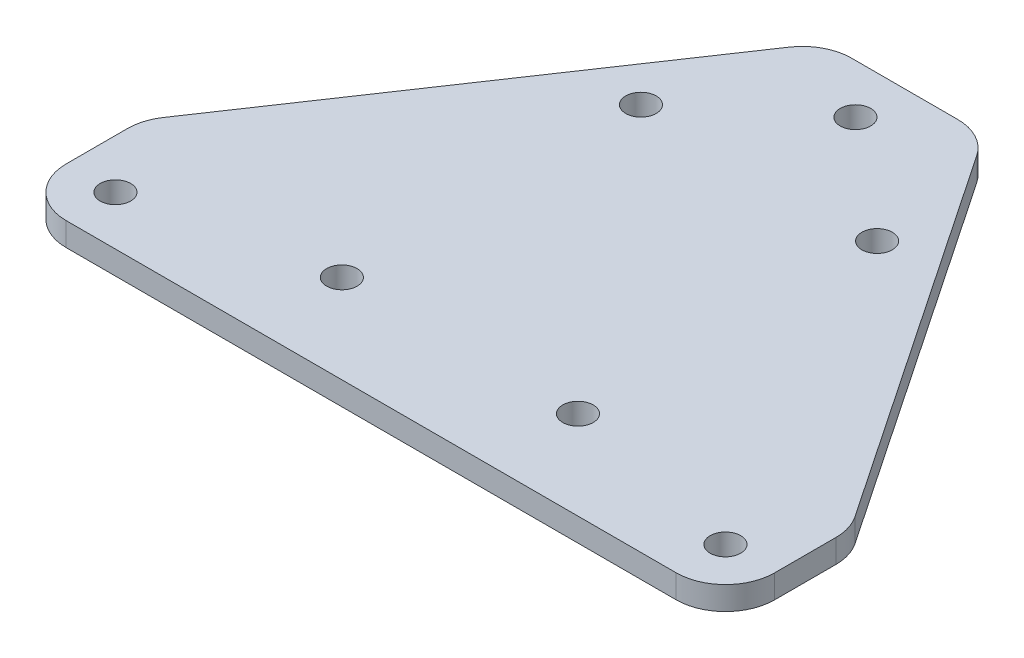
ISO-10303-21;
HEADER;
FILE_DESCRIPTION(('STEP AP214'),'2;1');
FILE_NAME('part.step','',(''),(''),'','','');
FILE_SCHEMA(('AUTOMOTIVE_DESIGN { 1 0 10303 214 1 1 1 1 }'));
ENDSEC;
DATA;
#1=APPLICATION_CONTEXT('core data for automotive mechanical design processes');
#2=APPLICATION_PROTOCOL_DEFINITION('international standard','automotive_design',2000,#1);
#3=PRODUCT_CONTEXT('',#1,'mechanical');
#4=PRODUCT('Part','Part','',(#3));
#5=PRODUCT_RELATED_PRODUCT_CATEGORY('part','',(#4));
#6=PRODUCT_DEFINITION_FORMATION('','',#4);
#7=PRODUCT_DEFINITION_CONTEXT('part definition',#1,'design');
#8=PRODUCT_DEFINITION('design','',#6,#7);
#9=PRODUCT_DEFINITION_SHAPE('','',#8);
#10=(LENGTH_UNIT() NAMED_UNIT(*) SI_UNIT(.MILLI.,.METRE.));
#11=(NAMED_UNIT(*) PLANE_ANGLE_UNIT() SI_UNIT($,.RADIAN.));
#12=(NAMED_UNIT(*) SI_UNIT($,.STERADIAN.) SOLID_ANGLE_UNIT());
#13=UNCERTAINTY_MEASURE_WITH_UNIT(LENGTH_MEASURE(1.E-05),#10,'distance_accuracy_value','');
#14=(GEOMETRIC_REPRESENTATION_CONTEXT(3) GLOBAL_UNCERTAINTY_ASSIGNED_CONTEXT((#13)) GLOBAL_UNIT_ASSIGNED_CONTEXT((#10,
#11,#12)) REPRESENTATION_CONTEXT('',''));
#15=CARTESIAN_POINT('',(0.,0.,0.));
#16=DIRECTION('',(0.,0.,1.));
#17=DIRECTION('',(1.,0.,0.));
#18=AXIS2_PLACEMENT_3D('',#15,#16,#17);
#19=CARTESIAN_POINT('',(31.,2.38,12.9889498330219));
#20=DIRECTION('',(0.,1.,0.));
#21=DIRECTION('',(0.,0.,1.));
#22=AXIS2_PLACEMENT_3D('',#19,#20,#21);
#23=PLANE('',#22);
#24=CARTESIAN_POINT('',(-12.,2.38,-15.2));
#25=DIRECTION('',(0.,1.,0.));
#26=DIRECTION('',(0.,0.,1.));
#27=AXIS2_PLACEMENT_3D('',#24,#25,#26);
#28=CIRCLE('',#27,1.55);
#29=CARTESIAN_POINT('',(-12.,2.38,-13.65));
#30=VERTEX_POINT('',#29);
#31=EDGE_CURVE('E304',#30,#30,#28,.T.);
#32=ORIENTED_EDGE('',*,*,#31,.F.);
#33=EDGE_LOOP('',(#32));
#34=FACE_BOUND('',#33,.T.);
#35=CARTESIAN_POINT('',(12.,2.38,15.2));
#36=DIRECTION('',(0.,1.,0.));
#37=DIRECTION('',(0.,0.,1.));
#38=AXIS2_PLACEMENT_3D('',#35,#36,#37);
#39=CIRCLE('',#38,1.55);
#40=CARTESIAN_POINT('',(12.,2.38,16.75));
#41=VERTEX_POINT('',#40);
#42=EDGE_CURVE('E316',#41,#41,#39,.T.);
#43=ORIENTED_EDGE('',*,*,#42,.F.);
#44=EDGE_LOOP('',(#43));
#45=FACE_BOUND('',#44,.T.);
#46=CARTESIAN_POINT('',(-31.,2.38,19.2153819388683));
#47=DIRECTION('',(0.,1.,0.));
#48=DIRECTION('',(0.,0.,1.));
#49=AXIS2_PLACEMENT_3D('',#46,#47,#48);
#50=CIRCLE('',#49,1.55);
#51=CARTESIAN_POINT('',(-31.,2.38,20.7653819388683));
#52=VERTEX_POINT('',#51);
#53=EDGE_CURVE('E328',#52,#52,#50,.T.);
#54=ORIENTED_EDGE('',*,*,#53,.F.);
#55=EDGE_LOOP('',(#54));
#56=FACE_BOUND('',#55,.T.);
#57=CARTESIAN_POINT('',(31.,2.38,12.9889498330219));
#58=DIRECTION('',(0.,1.,0.));
#59=DIRECTION('',(0.,0.,1.));
#60=AXIS2_PLACEMENT_3D('',#57,#58,#59);
#61=CIRCLE('',#60,5.);
#62=CARTESIAN_POINT('',(36.,2.38,12.988949833022));
#63=VERTEX_POINT('',#62);
#64=CARTESIAN_POINT('',(35.1461208841162,2.38,10.1943690747872));
#65=VERTEX_POINT('',#64);
#66=EDGE_CURVE('E177',#63,#65,#61,.T.);
#67=ORIENTED_EDGE('',*,*,#66,.T.);
#68=DIRECTION('',(-0.558916151646946,0.,-0.829224176823233));
#69=VECTOR('',#68,1.);
#70=CARTESIAN_POINT('',(9.54069566952106,2.38,-27.7945807582347));
#71=LINE('',#70,#69);
#72=CARTESIAN_POINT('',(9.54069566952106,2.38,-27.7945807582347));
#73=VERTEX_POINT('',#72);
#74=EDGE_CURVE('E105',#65,#73,#71,.T.);
#75=ORIENTED_EDGE('',*,*,#74,.T.);
#76=CARTESIAN_POINT('',(5.39457478540488,2.38,-25.));
#77=DIRECTION('',(0.,1.,0.));
#78=DIRECTION('',(0.,0.,1.));
#79=AXIS2_PLACEMENT_3D('',#76,#77,#78);
#80=CIRCLE('',#79,5.);
#81=CARTESIAN_POINT('',(5.39457478540486,2.38,-30.));
#82=VERTEX_POINT('',#81);
#83=EDGE_CURVE('E204',#73,#82,#80,.T.);
#84=ORIENTED_EDGE('',*,*,#83,.T.);
#85=DIRECTION('',(-1.,0.,0.));
#86=VECTOR('',#85,1.);
#87=CARTESIAN_POINT('',(-5.39457478540485,2.38,-30.));
#88=LINE('',#87,#86);
#89=CARTESIAN_POINT('',(-5.39457478540485,2.38,-30.));
#90=VERTEX_POINT('',#89);
#91=EDGE_CURVE('E223',#82,#90,#88,.T.);
#92=ORIENTED_EDGE('',*,*,#91,.T.);
#93=CARTESIAN_POINT('',(-5.39457478540487,2.38,-25.));
#94=DIRECTION('',(0.,1.,0.));
#95=DIRECTION('',(0.,0.,1.));
#96=AXIS2_PLACEMENT_3D('',#93,#94,#95);
#97=CIRCLE('',#96,5.);
#98=CARTESIAN_POINT('',(-9.54069566952105,2.38,-27.7945807582347));
#99=VERTEX_POINT('',#98);
#100=EDGE_CURVE('E220',#90,#99,#97,.T.);
#101=ORIENTED_EDGE('',*,*,#100,.T.);
#102=DIRECTION('',(-0.558916151646946,0.,0.829224176823233));
#103=VECTOR('',#102,1.);
#104=CARTESIAN_POINT('',(-9.54069566952105,2.38,-27.7945807582347));
#105=LINE('',#104,#103);
#106=CARTESIAN_POINT('',(-35.1461208841162,2.38,10.1943690747872));
#107=VERTEX_POINT('',#106);
#108=EDGE_CURVE('E222',#99,#107,#105,.T.);
#109=ORIENTED_EDGE('',*,*,#108,.T.);
#110=CARTESIAN_POINT('',(-31.,2.38,12.9889498330219));
#111=DIRECTION('',(0.,1.,0.));
#112=DIRECTION('',(0.,0.,-1.));
#113=AXIS2_PLACEMENT_3D('',#110,#111,#112);
#114=CIRCLE('',#113,5.);
#115=CARTESIAN_POINT('',(-36.,2.38,12.9889498330219));
#116=VERTEX_POINT('',#115);
#117=EDGE_CURVE('E225',#107,#116,#114,.T.);
#118=ORIENTED_EDGE('',*,*,#117,.T.);
#119=DIRECTION('',(0.,0.,1.));
#120=VECTOR('',#119,1.);
#121=CARTESIAN_POINT('',(-36.,2.38,12.9889498330219));
#122=LINE('',#121,#120);
#123=CARTESIAN_POINT('',(-36.,2.38,19.2153819388682));
#124=VERTEX_POINT('',#123);
#125=EDGE_CURVE('E231',#116,#124,#122,.T.);
#126=ORIENTED_EDGE('',*,*,#125,.T.);
#127=CARTESIAN_POINT('',(-31.,2.38,19.2153819388683));
#128=DIRECTION('',(0.,1.,0.));
#129=DIRECTION('',(0.,0.,1.));
#130=AXIS2_PLACEMENT_3D('',#127,#128,#129);
#131=CIRCLE('',#130,5.);
#132=CARTESIAN_POINT('',(-31.,2.38,24.2153819388683));
#133=VERTEX_POINT('',#132);
#134=EDGE_CURVE('E136',#124,#133,#131,.T.);
#135=ORIENTED_EDGE('',*,*,#134,.T.);
#136=DIRECTION('',(1.,0.,0.));
#137=VECTOR('',#136,1.);
#138=CARTESIAN_POINT('',(-31.,2.38,24.2153819388683));
#139=LINE('',#138,#137);
#140=CARTESIAN_POINT('',(30.9999999999999,2.38,24.2153819388683));
#141=VERTEX_POINT('',#140);
#142=EDGE_CURVE('E130',#133,#141,#139,.T.);
#143=ORIENTED_EDGE('',*,*,#142,.T.);
#144=CARTESIAN_POINT('',(31.,2.38,19.2153819388683));
#145=DIRECTION('',(0.,1.,0.));
#146=DIRECTION('',(0.,0.,-1.));
#147=AXIS2_PLACEMENT_3D('',#144,#145,#146);
#148=CIRCLE('',#147,5.);
#149=CARTESIAN_POINT('',(36.,2.38,19.2153819388683));
#150=VERTEX_POINT('',#149);
#151=EDGE_CURVE('E134',#141,#150,#148,.T.);
#152=ORIENTED_EDGE('',*,*,#151,.T.);
#153=DIRECTION('',(0.,0.,-1.));
#154=VECTOR('',#153,1.);
#155=CARTESIAN_POINT('',(36.,2.38,12.988949833022));
#156=LINE('',#155,#154);
#157=EDGE_CURVE('E50',#150,#63,#156,.T.);
#158=ORIENTED_EDGE('',*,*,#157,.T.);
#159=EDGE_LOOP('',(#67,#75,#84,#92,#101,#109,#118,#126,#135,#143,#152,#158));
#160=FACE_BOUND('',#159,.T.);
#161=CARTESIAN_POINT('',(0.,2.38,-25.));
#162=DIRECTION('',(0.,1.,0.));
#163=DIRECTION('',(0.,0.,1.));
#164=AXIS2_PLACEMENT_3D('',#161,#162,#163);
#165=CIRCLE('',#164,1.55);
#166=CARTESIAN_POINT('',(0.,2.38,-23.45));
#167=VERTEX_POINT('',#166);
#168=EDGE_CURVE('E158',#167,#167,#165,.T.);
#169=ORIENTED_EDGE('',*,*,#168,.F.);
#170=EDGE_LOOP('',(#169));
#171=FACE_BOUND('',#170,.T.);
#172=CARTESIAN_POINT('',(31.,2.38,19.2153819388683));
#173=DIRECTION('',(0.,1.,0.));
#174=DIRECTION('',(0.,0.,1.));
#175=AXIS2_PLACEMENT_3D('',#172,#173,#174);
#176=CIRCLE('',#175,1.55);
#177=CARTESIAN_POINT('',(31.,2.38,20.7653819388683));
#178=VERTEX_POINT('',#177);
#179=EDGE_CURVE('E322',#178,#178,#176,.T.);
#180=ORIENTED_EDGE('',*,*,#179,.F.);
#181=EDGE_LOOP('',(#180));
#182=FACE_BOUND('',#181,.T.);
#183=CARTESIAN_POINT('',(-12.,2.38,15.2));
#184=DIRECTION('',(0.,1.,0.));
#185=DIRECTION('',(0.,0.,1.));
#186=AXIS2_PLACEMENT_3D('',#183,#184,#185);
#187=CIRCLE('',#186,1.55);
#188=CARTESIAN_POINT('',(-12.,2.38,16.75));
#189=VERTEX_POINT('',#188);
#190=EDGE_CURVE('E310',#189,#189,#187,.T.);
#191=ORIENTED_EDGE('',*,*,#190,.F.);
#192=EDGE_LOOP('',(#191));
#193=FACE_BOUND('',#192,.T.);
#194=CARTESIAN_POINT('',(12.,2.38,-15.2));
#195=DIRECTION('',(0.,1.,0.));
#196=DIRECTION('',(0.,0.,1.));
#197=AXIS2_PLACEMENT_3D('',#194,#195,#196);
#198=CIRCLE('',#197,1.55);
#199=CARTESIAN_POINT('',(12.,2.38,-13.65));
#200=VERTEX_POINT('',#199);
#201=EDGE_CURVE('E295',#200,#200,#198,.T.);
#202=ORIENTED_EDGE('',*,*,#201,.F.);
#203=EDGE_LOOP('',(#202));
#204=FACE_BOUND('',#203,.T.);
#205=ADVANCED_FACE('F33',(#34,#45,#56,#160,#171,#182,#193,#204),#23,.T.);
#206=CARTESIAN_POINT('',(31.,0.,12.9889498330219));
#207=DIRECTION('',(0.,1.,0.));
#208=DIRECTION('',(0.,0.,1.));
#209=AXIS2_PLACEMENT_3D('',#206,#207,#208);
#210=PLANE('',#209);
#211=CARTESIAN_POINT('',(-12.,0.,-15.2));
#212=DIRECTION('',(0.,1.,0.));
#213=DIRECTION('',(0.,0.,1.));
#214=AXIS2_PLACEMENT_3D('',#211,#212,#213);
#215=CIRCLE('',#214,1.55);
#216=CARTESIAN_POINT('',(-12.,0.,-13.65));
#217=VERTEX_POINT('',#216);
#218=EDGE_CURVE('E301',#217,#217,#215,.T.);
#219=ORIENTED_EDGE('',*,*,#218,.T.);
#220=EDGE_LOOP('',(#219));
#221=FACE_BOUND('',#220,.T.);
#222=CARTESIAN_POINT('',(12.,0.,15.2));
#223=DIRECTION('',(0.,1.,0.));
#224=DIRECTION('',(0.,0.,1.));
#225=AXIS2_PLACEMENT_3D('',#222,#223,#224);
#226=CIRCLE('',#225,1.55);
#227=CARTESIAN_POINT('',(12.,0.,16.75));
#228=VERTEX_POINT('',#227);
#229=EDGE_CURVE('E313',#228,#228,#226,.T.);
#230=ORIENTED_EDGE('',*,*,#229,.T.);
#231=EDGE_LOOP('',(#230));
#232=FACE_BOUND('',#231,.T.);
#233=CARTESIAN_POINT('',(-31.,0.,19.2153819388683));
#234=DIRECTION('',(0.,1.,0.));
#235=DIRECTION('',(0.,0.,1.));
#236=AXIS2_PLACEMENT_3D('',#233,#234,#235);
#237=CIRCLE('',#236,1.55);
#238=CARTESIAN_POINT('',(-31.,0.,20.7653819388683));
#239=VERTEX_POINT('',#238);
#240=EDGE_CURVE('E325',#239,#239,#237,.T.);
#241=ORIENTED_EDGE('',*,*,#240,.T.);
#242=EDGE_LOOP('',(#241));
#243=FACE_BOUND('',#242,.T.);
#244=CARTESIAN_POINT('',(31.,0.,12.9889498330219));
#245=DIRECTION('',(0.,1.,0.));
#246=DIRECTION('',(0.,0.,1.));
#247=AXIS2_PLACEMENT_3D('',#244,#245,#246);
#248=CIRCLE('',#247,5.);
#249=CARTESIAN_POINT('',(36.,0.,12.988949833022));
#250=VERTEX_POINT('',#249);
#251=CARTESIAN_POINT('',(35.1461208841162,0.,10.1943690747872));
#252=VERTEX_POINT('',#251);
#253=EDGE_CURVE('E154',#250,#252,#248,.T.);
#254=ORIENTED_EDGE('',*,*,#253,.F.);
#255=DIRECTION('',(0.,0.,-1.));
#256=VECTOR('',#255,1.);
#257=CARTESIAN_POINT('',(36.,0.,12.988949833022));
#258=LINE('',#257,#256);
#259=CARTESIAN_POINT('',(36.,0.,19.2153819388683));
#260=VERTEX_POINT('',#259);
#261=EDGE_CURVE('E97',#260,#250,#258,.T.);
#262=ORIENTED_EDGE('',*,*,#261,.F.);
#263=CARTESIAN_POINT('',(31.,0.,19.2153819388683));
#264=DIRECTION('',(0.,1.,0.));
#265=DIRECTION('',(0.,0.,-1.));
#266=AXIS2_PLACEMENT_3D('',#263,#264,#265);
#267=CIRCLE('',#266,5.);
#268=CARTESIAN_POINT('',(30.9999999999999,0.,24.2153819388683));
#269=VERTEX_POINT('',#268);
#270=EDGE_CURVE('E91',#269,#260,#267,.T.);
#271=ORIENTED_EDGE('',*,*,#270,.F.);
#272=DIRECTION('',(1.,0.,0.));
#273=VECTOR('',#272,1.);
#274=CARTESIAN_POINT('',(-31.,0.,24.2153819388683));
#275=LINE('',#274,#273);
#276=CARTESIAN_POINT('',(-31.,0.,24.2153819388683));
#277=VERTEX_POINT('',#276);
#278=EDGE_CURVE('E144',#277,#269,#275,.T.);
#279=ORIENTED_EDGE('',*,*,#278,.F.);
#280=CARTESIAN_POINT('',(-31.,0.,19.2153819388683));
#281=DIRECTION('',(0.,1.,0.));
#282=DIRECTION('',(0.,0.,1.));
#283=AXIS2_PLACEMENT_3D('',#280,#281,#282);
#284=CIRCLE('',#283,5.);
#285=CARTESIAN_POINT('',(-36.,0.,19.2153819388682));
#286=VERTEX_POINT('',#285);
#287=EDGE_CURVE('E172',#286,#277,#284,.T.);
#288=ORIENTED_EDGE('',*,*,#287,.F.);
#289=DIRECTION('',(0.,0.,1.));
#290=VECTOR('',#289,1.);
#291=CARTESIAN_POINT('',(-36.,0.,12.9889498330219));
#292=LINE('',#291,#290);
#293=CARTESIAN_POINT('',(-36.,0.,12.9889498330219));
#294=VERTEX_POINT('',#293);
#295=EDGE_CURVE('E170',#294,#286,#292,.T.);
#296=ORIENTED_EDGE('',*,*,#295,.F.);
#297=CARTESIAN_POINT('',(-31.,0.,12.9889498330219));
#298=DIRECTION('',(0.,1.,0.));
#299=DIRECTION('',(0.,0.,-1.));
#300=AXIS2_PLACEMENT_3D('',#297,#298,#299);
#301=CIRCLE('',#300,5.);
#302=CARTESIAN_POINT('',(-35.1461208841162,0.,10.1943690747872));
#303=VERTEX_POINT('',#302);
#304=EDGE_CURVE('E168',#303,#294,#301,.T.);
#305=ORIENTED_EDGE('',*,*,#304,.F.);
#306=DIRECTION('',(-0.558916151646946,0.,0.829224176823233));
#307=VECTOR('',#306,1.);
#308=CARTESIAN_POINT('',(-9.54069566952105,0.,-27.7945807582347));
#309=LINE('',#308,#307);
#310=CARTESIAN_POINT('',(-9.54069566952105,0.,-27.7945807582347));
#311=VERTEX_POINT('',#310);
#312=EDGE_CURVE('E166',#311,#303,#309,.T.);
#313=ORIENTED_EDGE('',*,*,#312,.F.);
#314=CARTESIAN_POINT('',(-5.39457478540487,0.,-25.));
#315=DIRECTION('',(0.,1.,0.));
#316=DIRECTION('',(0.,0.,1.));
#317=AXIS2_PLACEMENT_3D('',#314,#315,#316);
#318=CIRCLE('',#317,5.);
#319=CARTESIAN_POINT('',(-5.39457478540485,0.,-30.));
#320=VERTEX_POINT('',#319);
#321=EDGE_CURVE('E164',#320,#311,#318,.T.);
#322=ORIENTED_EDGE('',*,*,#321,.F.);
#323=DIRECTION('',(-1.,0.,0.));
#324=VECTOR('',#323,1.);
#325=CARTESIAN_POINT('',(-5.39457478540485,0.,-30.));
#326=LINE('',#325,#324);
#327=CARTESIAN_POINT('',(5.39457478540486,0.,-30.));
#328=VERTEX_POINT('',#327);
#329=EDGE_CURVE('E162',#328,#320,#326,.T.);
#330=ORIENTED_EDGE('',*,*,#329,.F.);
#331=CARTESIAN_POINT('',(5.39457478540488,0.,-25.));
#332=DIRECTION('',(0.,1.,0.));
#333=DIRECTION('',(0.,0.,1.));
#334=AXIS2_PLACEMENT_3D('',#331,#332,#333);
#335=CIRCLE('',#334,5.);
#336=CARTESIAN_POINT('',(9.54069566952106,0.,-27.7945807582347));
#337=VERTEX_POINT('',#336);
#338=EDGE_CURVE('E160',#337,#328,#335,.T.);
#339=ORIENTED_EDGE('',*,*,#338,.F.);
#340=DIRECTION('',(-0.558916151646946,0.,-0.829224176823233));
#341=VECTOR('',#340,1.);
#342=CARTESIAN_POINT('',(9.54069566952106,0.,-27.7945807582347));
#343=LINE('',#342,#341);
#344=EDGE_CURVE('E157',#252,#337,#343,.T.);
#345=ORIENTED_EDGE('',*,*,#344,.F.);
#346=EDGE_LOOP('',(#254,#262,#271,#279,#288,#296,#305,#313,#322,#330,#339,#345));
#347=FACE_BOUND('',#346,.T.);
#348=CARTESIAN_POINT('',(0.,0.,-25.));
#349=DIRECTION('',(0.,1.,0.));
#350=DIRECTION('',(0.,0.,1.));
#351=AXIS2_PLACEMENT_3D('',#348,#349,#350);
#352=CIRCLE('',#351,1.55);
#353=CARTESIAN_POINT('',(0.,0.,-23.45));
#354=VERTEX_POINT('',#353);
#355=EDGE_CURVE('E331',#354,#354,#352,.T.);
#356=ORIENTED_EDGE('',*,*,#355,.T.);
#357=EDGE_LOOP('',(#356));
#358=FACE_BOUND('',#357,.T.);
#359=CARTESIAN_POINT('',(31.,0.,19.2153819388683));
#360=DIRECTION('',(0.,1.,0.));
#361=DIRECTION('',(0.,0.,1.));
#362=AXIS2_PLACEMENT_3D('',#359,#360,#361);
#363=CIRCLE('',#362,1.55);
#364=CARTESIAN_POINT('',(31.,0.,20.7653819388683));
#365=VERTEX_POINT('',#364);
#366=EDGE_CURVE('E319',#365,#365,#363,.T.);
#367=ORIENTED_EDGE('',*,*,#366,.T.);
#368=EDGE_LOOP('',(#367));
#369=FACE_BOUND('',#368,.T.);
#370=CARTESIAN_POINT('',(-12.,0.,15.2));
#371=DIRECTION('',(0.,1.,0.));
#372=DIRECTION('',(0.,0.,1.));
#373=AXIS2_PLACEMENT_3D('',#370,#371,#372);
#374=CIRCLE('',#373,1.55);
#375=CARTESIAN_POINT('',(-12.,0.,16.75));
#376=VERTEX_POINT('',#375);
#377=EDGE_CURVE('E307',#376,#376,#374,.T.);
#378=ORIENTED_EDGE('',*,*,#377,.T.);
#379=EDGE_LOOP('',(#378));
#380=FACE_BOUND('',#379,.T.);
#381=CARTESIAN_POINT('',(12.,0.,-15.2));
#382=DIRECTION('',(0.,1.,0.));
#383=DIRECTION('',(0.,0.,1.));
#384=AXIS2_PLACEMENT_3D('',#381,#382,#383);
#385=CIRCLE('',#384,1.55);
#386=CARTESIAN_POINT('',(12.,0.,-13.65));
#387=VERTEX_POINT('',#386);
#388=EDGE_CURVE('E298',#387,#387,#385,.T.);
#389=ORIENTED_EDGE('',*,*,#388,.T.);
#390=EDGE_LOOP('',(#389));
#391=FACE_BOUND('',#390,.T.);
#392=ADVANCED_FACE('F208',(#221,#232,#243,#347,#358,#369,#380,#391),#210,.F.);
#393=CARTESIAN_POINT('',(31.,2.38,12.9889498330219));
#394=DIRECTION('',(0.,-1.,0.));
#395=DIRECTION('',(0.,0.,-1.));
#396=AXIS2_PLACEMENT_3D('',#393,#394,#395);
#397=CYLINDRICAL_SURFACE('',#396,5.);
#398=ORIENTED_EDGE('',*,*,#253,.T.);
#399=DIRECTION('',(0.,-1.,0.));
#400=VECTOR('',#399,1.);
#401=CARTESIAN_POINT('',(35.1461208841162,2.38,10.1943690747872));
#402=LINE('',#401,#400);
#403=EDGE_CURVE('E11',#65,#252,#402,.T.);
#404=ORIENTED_EDGE('',*,*,#403,.F.);
#405=ORIENTED_EDGE('',*,*,#66,.F.);
#406=DIRECTION('',(0.,-1.,0.));
#407=VECTOR('',#406,1.);
#408=CARTESIAN_POINT('',(36.,2.38,12.988949833022));
#409=LINE('',#408,#407);
#410=EDGE_CURVE('E150',#63,#250,#409,.T.);
#411=ORIENTED_EDGE('',*,*,#410,.T.);
#412=EDGE_LOOP('',(#398,#404,#405,#411));
#413=FACE_BOUND('',#412,.T.);
#414=ADVANCED_FACE('F35',(#413),#397,.T.);
#415=CARTESIAN_POINT('',(9.54069566952106,2.38,-27.7945807582347));
#416=DIRECTION('',(-0.829224176823233,0.,0.558916151646946));
#417=DIRECTION('',(0.558916151646946,0.,0.829224176823233));
#418=AXIS2_PLACEMENT_3D('',#415,#416,#417);
#419=PLANE('',#418);
#420=ORIENTED_EDGE('',*,*,#344,.T.);
#421=DIRECTION('',(0.,-1.,0.));
#422=VECTOR('',#421,1.);
#423=CARTESIAN_POINT('',(9.54069566952106,2.38,-27.7945807582347));
#424=LINE('',#423,#422);
#425=EDGE_CURVE('E42',#73,#337,#424,.T.);
#426=ORIENTED_EDGE('',*,*,#425,.F.);
#427=ORIENTED_EDGE('',*,*,#74,.F.);
#428=ORIENTED_EDGE('',*,*,#403,.T.);
#429=EDGE_LOOP('',(#420,#426,#427,#428));
#430=FACE_BOUND('',#429,.T.);
#431=ADVANCED_FACE('F467',(#430),#419,.F.);
#432=CARTESIAN_POINT('',(5.39457478540488,2.38,-25.));
#433=DIRECTION('',(0.,-1.,0.));
#434=DIRECTION('',(0.,0.,-1.));
#435=AXIS2_PLACEMENT_3D('',#432,#433,#434);
#436=CYLINDRICAL_SURFACE('',#435,5.);
#437=ORIENTED_EDGE('',*,*,#338,.T.);
#438=DIRECTION('',(0.,-1.,0.));
#439=VECTOR('',#438,1.);
#440=CARTESIAN_POINT('',(5.39457478540486,2.38,-30.));
#441=LINE('',#440,#439);
#442=EDGE_CURVE('E196',#82,#328,#441,.T.);
#443=ORIENTED_EDGE('',*,*,#442,.F.);
#444=ORIENTED_EDGE('',*,*,#83,.F.);
#445=ORIENTED_EDGE('',*,*,#425,.T.);
#446=EDGE_LOOP('',(#437,#443,#444,#445));
#447=FACE_BOUND('',#446,.T.);
#448=ADVANCED_FACE('F202',(#447),#436,.T.);
#449=CARTESIAN_POINT('',(-5.39457478540485,2.38,-30.));
#450=DIRECTION('',(0.,0.,1.));
#451=DIRECTION('',(1.,0.,0.));
#452=AXIS2_PLACEMENT_3D('',#449,#450,#451);
#453=PLANE('',#452);
#454=ORIENTED_EDGE('',*,*,#329,.T.);
#455=DIRECTION('',(0.,-1.,0.));
#456=VECTOR('',#455,1.);
#457=CARTESIAN_POINT('',(-5.39457478540485,2.38,-30.));
#458=LINE('',#457,#456);
#459=EDGE_CURVE('E193',#90,#320,#458,.T.);
#460=ORIENTED_EDGE('',*,*,#459,.F.);
#461=ORIENTED_EDGE('',*,*,#91,.F.);
#462=ORIENTED_EDGE('',*,*,#442,.T.);
#463=EDGE_LOOP('',(#454,#460,#461,#462));
#464=FACE_BOUND('',#463,.T.);
#465=ADVANCED_FACE('F214',(#464),#453,.F.);
#466=CARTESIAN_POINT('',(-5.39457478540487,2.38,-25.));
#467=DIRECTION('',(0.,-1.,0.));
#468=DIRECTION('',(0.,0.,-1.));
#469=AXIS2_PLACEMENT_3D('',#466,#467,#468);
#470=CYLINDRICAL_SURFACE('',#469,5.);
#471=ORIENTED_EDGE('',*,*,#321,.T.);
#472=DIRECTION('',(0.,-1.,0.));
#473=VECTOR('',#472,1.);
#474=CARTESIAN_POINT('',(-9.54069566952105,2.38,-27.7945807582347));
#475=LINE('',#474,#473);
#476=EDGE_CURVE('E190',#99,#311,#475,.T.);
#477=ORIENTED_EDGE('',*,*,#476,.F.);
#478=ORIENTED_EDGE('',*,*,#100,.F.);
#479=ORIENTED_EDGE('',*,*,#459,.T.);
#480=EDGE_LOOP('',(#471,#477,#478,#479));
#481=FACE_BOUND('',#480,.T.);
#482=ADVANCED_FACE('F218',(#481),#470,.T.);
#483=CARTESIAN_POINT('',(-9.54069566952105,2.38,-27.7945807582347));
#484=DIRECTION('',(0.829224176823233,0.,0.558916151646946));
#485=DIRECTION('',(0.558916151646946,0.,-0.829224176823233));
#486=AXIS2_PLACEMENT_3D('',#483,#484,#485);
#487=PLANE('',#486);
#488=ORIENTED_EDGE('',*,*,#312,.T.);
#489=DIRECTION('',(0.,-1.,0.));
#490=VECTOR('',#489,1.);
#491=CARTESIAN_POINT('',(-35.1461208841162,2.38,10.1943690747872));
#492=LINE('',#491,#490);
#493=EDGE_CURVE('E187',#107,#303,#492,.T.);
#494=ORIENTED_EDGE('',*,*,#493,.F.);
#495=ORIENTED_EDGE('',*,*,#108,.F.);
#496=ORIENTED_EDGE('',*,*,#476,.T.);
#497=EDGE_LOOP('',(#488,#494,#495,#496));
#498=FACE_BOUND('',#497,.T.);
#499=ADVANCED_FACE('F432',(#498),#487,.F.);
#500=CARTESIAN_POINT('',(-31.,2.38,12.9889498330219));
#501=DIRECTION('',(0.,-1.,0.));
#502=DIRECTION('',(0.,0.,-1.));
#503=AXIS2_PLACEMENT_3D('',#500,#501,#502);
#504=CYLINDRICAL_SURFACE('',#503,5.);
#505=ORIENTED_EDGE('',*,*,#304,.T.);
#506=DIRECTION('',(0.,-1.,0.));
#507=VECTOR('',#506,1.);
#508=CARTESIAN_POINT('',(-36.,2.38,12.9889498330219));
#509=LINE('',#508,#507);
#510=EDGE_CURVE('E184',#116,#294,#509,.T.);
#511=ORIENTED_EDGE('',*,*,#510,.F.);
#512=ORIENTED_EDGE('',*,*,#117,.F.);
#513=ORIENTED_EDGE('',*,*,#493,.T.);
#514=EDGE_LOOP('',(#505,#511,#512,#513));
#515=FACE_BOUND('',#514,.T.);
#516=ADVANCED_FACE('F423',(#515),#504,.T.);
#517=CARTESIAN_POINT('',(-36.,2.38,12.9889498330219));
#518=DIRECTION('',(1.,0.,0.));
#519=DIRECTION('',(0.,0.,-1.));
#520=AXIS2_PLACEMENT_3D('',#517,#518,#519);
#521=PLANE('',#520);
#522=ORIENTED_EDGE('',*,*,#295,.T.);
#523=DIRECTION('',(0.,-1.,0.));
#524=VECTOR('',#523,1.);
#525=CARTESIAN_POINT('',(-36.,2.38,19.2153819388682));
#526=LINE('',#525,#524);
#527=EDGE_CURVE('E181',#124,#286,#526,.T.);
#528=ORIENTED_EDGE('',*,*,#527,.F.);
#529=ORIENTED_EDGE('',*,*,#125,.F.);
#530=ORIENTED_EDGE('',*,*,#510,.T.);
#531=EDGE_LOOP('',(#522,#528,#529,#530));
#532=FACE_BOUND('',#531,.T.);
#533=ADVANCED_FACE('F237',(#532),#521,.F.);
#534=CARTESIAN_POINT('',(-31.,2.38,19.2153819388683));
#535=DIRECTION('',(0.,-1.,0.));
#536=DIRECTION('',(0.,0.,-1.));
#537=AXIS2_PLACEMENT_3D('',#534,#535,#536);
#538=CYLINDRICAL_SURFACE('',#537,5.);
#539=ORIENTED_EDGE('',*,*,#287,.T.);
#540=DIRECTION('',(0.,-1.,0.));
#541=VECTOR('',#540,1.);
#542=CARTESIAN_POINT('',(-31.,2.38,24.2153819388683));
#543=LINE('',#542,#541);
#544=EDGE_CURVE('E145',#133,#277,#543,.T.);
#545=ORIENTED_EDGE('',*,*,#544,.F.);
#546=ORIENTED_EDGE('',*,*,#134,.F.);
#547=ORIENTED_EDGE('',*,*,#527,.T.);
#548=EDGE_LOOP('',(#539,#545,#546,#547));
#549=FACE_BOUND('',#548,.T.);
#550=ADVANCED_FACE('F241',(#549),#538,.T.);
#551=CARTESIAN_POINT('',(-31.,2.38,24.2153819388683));
#552=DIRECTION('',(0.,0.,-1.));
#553=DIRECTION('',(-1.,0.,0.));
#554=AXIS2_PLACEMENT_3D('',#551,#552,#553);
#555=PLANE('',#554);
#556=ORIENTED_EDGE('',*,*,#278,.T.);
#557=DIRECTION('',(0.,-1.,0.));
#558=VECTOR('',#557,1.);
#559=CARTESIAN_POINT('',(30.9999999999999,2.38,24.2153819388683));
#560=LINE('',#559,#558);
#561=EDGE_CURVE('E141',#141,#269,#560,.T.);
#562=ORIENTED_EDGE('',*,*,#561,.F.);
#563=ORIENTED_EDGE('',*,*,#142,.F.);
#564=ORIENTED_EDGE('',*,*,#544,.T.);
#565=EDGE_LOOP('',(#556,#562,#563,#564));
#566=FACE_BOUND('',#565,.T.);
#567=ADVANCED_FACE('F142',(#566),#555,.F.);
#568=CARTESIAN_POINT('',(31.,2.38,19.2153819388683));
#569=DIRECTION('',(0.,-1.,0.));
#570=DIRECTION('',(0.,0.,-1.));
#571=AXIS2_PLACEMENT_3D('',#568,#569,#570);
#572=CYLINDRICAL_SURFACE('',#571,5.);
#573=ORIENTED_EDGE('',*,*,#270,.T.);
#574=DIRECTION('',(0.,-1.,0.));
#575=VECTOR('',#574,1.);
#576=CARTESIAN_POINT('',(36.,2.38,19.2153819388683));
#577=LINE('',#576,#575);
#578=EDGE_CURVE('E146',#150,#260,#577,.T.);
#579=ORIENTED_EDGE('',*,*,#578,.F.);
#580=ORIENTED_EDGE('',*,*,#151,.F.);
#581=ORIENTED_EDGE('',*,*,#561,.T.);
#582=EDGE_LOOP('',(#573,#579,#580,#581));
#583=FACE_BOUND('',#582,.T.);
#584=ADVANCED_FACE('F148',(#583),#572,.T.);
#585=CARTESIAN_POINT('',(36.,2.38,12.988949833022));
#586=DIRECTION('',(-1.,0.,0.));
#587=DIRECTION('',(0.,0.,1.));
#588=AXIS2_PLACEMENT_3D('',#585,#586,#587);
#589=PLANE('',#588);
#590=ORIENTED_EDGE('',*,*,#261,.T.);
#591=ORIENTED_EDGE('',*,*,#410,.F.);
#592=ORIENTED_EDGE('',*,*,#157,.F.);
#593=ORIENTED_EDGE('',*,*,#578,.T.);
#594=EDGE_LOOP('',(#590,#591,#592,#593));
#595=FACE_BOUND('',#594,.T.);
#596=ADVANCED_FACE('F245',(#595),#589,.F.);
#597=CARTESIAN_POINT('',(0.,2.38,-25.));
#598=DIRECTION('',(0.,-1.,0.));
#599=DIRECTION('',(0.,0.,-1.));
#600=AXIS2_PLACEMENT_3D('',#597,#598,#599);
#601=CYLINDRICAL_SURFACE('',#600,1.55);
#602=ORIENTED_EDGE('',*,*,#168,.T.);
#603=EDGE_LOOP('',(#602));
#604=FACE_BOUND('',#603,.T.);
#605=ORIENTED_EDGE('',*,*,#355,.F.);
#606=EDGE_LOOP('',(#605));
#607=FACE_BOUND('',#606,.T.);
#608=ADVANCED_FACE('F247',(#604,#607),#601,.F.);
#609=CARTESIAN_POINT('',(-31.,2.38,19.2153819388683));
#610=DIRECTION('',(0.,-1.,0.));
#611=DIRECTION('',(0.,0.,-1.));
#612=AXIS2_PLACEMENT_3D('',#609,#610,#611);
#613=CYLINDRICAL_SURFACE('',#612,1.55);
#614=ORIENTED_EDGE('',*,*,#53,.T.);
#615=EDGE_LOOP('',(#614));
#616=FACE_BOUND('',#615,.T.);
#617=ORIENTED_EDGE('',*,*,#240,.F.);
#618=EDGE_LOOP('',(#617));
#619=FACE_BOUND('',#618,.T.);
#620=ADVANCED_FACE('F253',(#616,#619),#613,.F.);
#621=CARTESIAN_POINT('',(31.,2.38,19.2153819388683));
#622=DIRECTION('',(0.,-1.,0.));
#623=DIRECTION('',(0.,0.,-1.));
#624=AXIS2_PLACEMENT_3D('',#621,#622,#623);
#625=CYLINDRICAL_SURFACE('',#624,1.55);
#626=ORIENTED_EDGE('',*,*,#179,.T.);
#627=EDGE_LOOP('',(#626));
#628=FACE_BOUND('',#627,.T.);
#629=ORIENTED_EDGE('',*,*,#366,.F.);
#630=EDGE_LOOP('',(#629));
#631=FACE_BOUND('',#630,.T.);
#632=ADVANCED_FACE('F270',(#628,#631),#625,.F.);
#633=CARTESIAN_POINT('',(12.,2.38,15.2));
#634=DIRECTION('',(0.,-1.,0.));
#635=DIRECTION('',(0.,0.,-1.));
#636=AXIS2_PLACEMENT_3D('',#633,#634,#635);
#637=CYLINDRICAL_SURFACE('',#636,1.55);
#638=ORIENTED_EDGE('',*,*,#42,.T.);
#639=EDGE_LOOP('',(#638));
#640=FACE_BOUND('',#639,.T.);
#641=ORIENTED_EDGE('',*,*,#229,.F.);
#642=EDGE_LOOP('',(#641));
#643=FACE_BOUND('',#642,.T.);
#644=ADVANCED_FACE('F274',(#640,#643),#637,.F.);
#645=CARTESIAN_POINT('',(-12.,2.38,15.2));
#646=DIRECTION('',(0.,-1.,0.));
#647=DIRECTION('',(0.,0.,-1.));
#648=AXIS2_PLACEMENT_3D('',#645,#646,#647);
#649=CYLINDRICAL_SURFACE('',#648,1.55);
#650=ORIENTED_EDGE('',*,*,#190,.T.);
#651=EDGE_LOOP('',(#650));
#652=FACE_BOUND('',#651,.T.);
#653=ORIENTED_EDGE('',*,*,#377,.F.);
#654=EDGE_LOOP('',(#653));
#655=FACE_BOUND('',#654,.T.);
#656=ADVANCED_FACE('F278',(#652,#655),#649,.F.);
#657=CARTESIAN_POINT('',(-12.,2.38,-15.2));
#658=DIRECTION('',(0.,-1.,0.));
#659=DIRECTION('',(0.,0.,-1.));
#660=AXIS2_PLACEMENT_3D('',#657,#658,#659);
#661=CYLINDRICAL_SURFACE('',#660,1.55);
#662=ORIENTED_EDGE('',*,*,#31,.T.);
#663=EDGE_LOOP('',(#662));
#664=FACE_BOUND('',#663,.T.);
#665=ORIENTED_EDGE('',*,*,#218,.F.);
#666=EDGE_LOOP('',(#665));
#667=FACE_BOUND('',#666,.T.);
#668=ADVANCED_FACE('F282',(#664,#667),#661,.F.);
#669=CARTESIAN_POINT('',(12.,2.38,-15.2));
#670=DIRECTION('',(0.,-1.,0.));
#671=DIRECTION('',(0.,0.,-1.));
#672=AXIS2_PLACEMENT_3D('',#669,#670,#671);
#673=CYLINDRICAL_SURFACE('',#672,1.55);
#674=ORIENTED_EDGE('',*,*,#201,.T.);
#675=EDGE_LOOP('',(#674));
#676=FACE_BOUND('',#675,.T.);
#677=ORIENTED_EDGE('',*,*,#388,.F.);
#678=EDGE_LOOP('',(#677));
#679=FACE_BOUND('',#678,.T.);
#680=ADVANCED_FACE('F286',(#676,#679),#673,.F.);
#681=CLOSED_SHELL('',(#205,#392,#414,#431,#448,#465,#482,#499,#516,#533,#550,#567,#584,#596,
#608,#620,#632,#644,#656,#668,#680));
#682=MANIFOLD_SOLID_BREP('B2',#681);
#683=ADVANCED_BREP_SHAPE_REPRESENTATION('',(#18,#682),#14);
#684=SHAPE_DEFINITION_REPRESENTATION(#9,#683);
ENDSEC;
END-ISO-10303-21;
